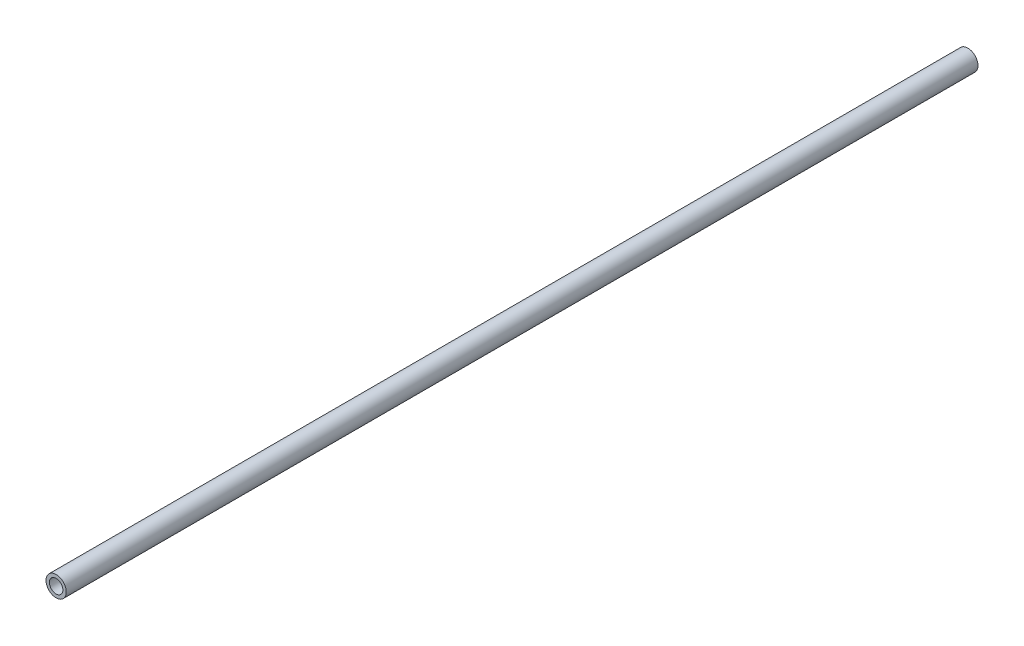
ISO-10303-21;
HEADER;
FILE_DESCRIPTION(('STEP AP214'),'2;1');
FILE_NAME('part.step','',(''),(''),'','','');
FILE_SCHEMA(('AUTOMOTIVE_DESIGN { 1 0 10303 214 1 1 1 1 }'));
ENDSEC;
DATA;
#1=APPLICATION_CONTEXT('core data for automotive mechanical design processes');
#2=APPLICATION_PROTOCOL_DEFINITION('international standard','automotive_design',2000,#1);
#3=PRODUCT_CONTEXT('',#1,'mechanical');
#4=PRODUCT('Part','Part','',(#3));
#5=PRODUCT_RELATED_PRODUCT_CATEGORY('part','',(#4));
#6=PRODUCT_DEFINITION_FORMATION('','',#4);
#7=PRODUCT_DEFINITION_CONTEXT('part definition',#1,'design');
#8=PRODUCT_DEFINITION('design','',#6,#7);
#9=PRODUCT_DEFINITION_SHAPE('','',#8);
#10=(LENGTH_UNIT() NAMED_UNIT(*) SI_UNIT(.MILLI.,.METRE.));
#11=(NAMED_UNIT(*) PLANE_ANGLE_UNIT() SI_UNIT($,.RADIAN.));
#12=(NAMED_UNIT(*) SI_UNIT($,.STERADIAN.) SOLID_ANGLE_UNIT());
#13=UNCERTAINTY_MEASURE_WITH_UNIT(LENGTH_MEASURE(1.E-05),#10,'distance_accuracy_value','');
#14=(GEOMETRIC_REPRESENTATION_CONTEXT(3) GLOBAL_UNCERTAINTY_ASSIGNED_CONTEXT((#13)) GLOBAL_UNIT_ASSIGNED_CONTEXT((#10,
#11,#12)) REPRESENTATION_CONTEXT('',''));
#15=CARTESIAN_POINT('',(0.,0.,0.));
#16=DIRECTION('',(0.,0.,1.));
#17=DIRECTION('',(1.,0.,0.));
#18=AXIS2_PLACEMENT_3D('',#15,#16,#17);
#19=CARTESIAN_POINT('',(0.,0.,270.));
#20=DIRECTION('',(0.,0.,1.));
#21=DIRECTION('',(1.,0.,0.));
#22=AXIS2_PLACEMENT_3D('',#19,#20,#21);
#23=PLANE('',#22);
#24=CARTESIAN_POINT('',(0.,0.,270.));
#25=DIRECTION('',(0.,0.,1.));
#26=DIRECTION('',(1.,0.,0.));
#27=AXIS2_PLACEMENT_3D('',#24,#25,#26);
#28=CIRCLE('',#27,3.);
#29=CARTESIAN_POINT('',(3.,0.,270.));
#30=VERTEX_POINT('',#29);
#31=EDGE_CURVE('E10',#30,#30,#28,.T.);
#32=ORIENTED_EDGE('',*,*,#31,.T.);
#33=EDGE_LOOP('',(#32));
#34=FACE_BOUND('',#33,.T.);
#35=CARTESIAN_POINT('',(0.,0.,270.));
#36=DIRECTION('',(0.,0.,1.));
#37=DIRECTION('',(1.,0.,0.));
#38=AXIS2_PLACEMENT_3D('',#35,#36,#37);
#39=CIRCLE('',#38,2.);
#40=CARTESIAN_POINT('',(2.,0.,270.));
#41=VERTEX_POINT('',#40);
#42=EDGE_CURVE('E54',#41,#41,#39,.T.);
#43=ORIENTED_EDGE('',*,*,#42,.F.);
#44=EDGE_LOOP('',(#43));
#45=FACE_BOUND('',#44,.T.);
#46=ADVANCED_FACE('F41',(#34,#45),#23,.T.);
#47=CARTESIAN_POINT('',(0.,0.,0.));
#48=DIRECTION('',(0.,0.,1.));
#49=DIRECTION('',(1.,0.,0.));
#50=AXIS2_PLACEMENT_3D('',#47,#48,#49);
#51=PLANE('',#50);
#52=CARTESIAN_POINT('',(0.,0.,0.));
#53=DIRECTION('',(0.,0.,1.));
#54=DIRECTION('',(1.,0.,0.));
#55=AXIS2_PLACEMENT_3D('',#52,#53,#54);
#56=CIRCLE('',#55,3.);
#57=CARTESIAN_POINT('',(3.,0.,0.));
#58=VERTEX_POINT('',#57);
#59=EDGE_CURVE('E45',#58,#58,#56,.T.);
#60=ORIENTED_EDGE('',*,*,#59,.F.);
#61=EDGE_LOOP('',(#60));
#62=FACE_BOUND('',#61,.T.);
#63=CARTESIAN_POINT('',(0.,0.,0.));
#64=DIRECTION('',(0.,0.,1.));
#65=DIRECTION('',(1.,0.,0.));
#66=AXIS2_PLACEMENT_3D('',#63,#64,#65);
#67=CIRCLE('',#66,2.);
#68=CARTESIAN_POINT('',(2.,0.,0.));
#69=VERTEX_POINT('',#68);
#70=EDGE_CURVE('E56',#69,#69,#67,.T.);
#71=ORIENTED_EDGE('',*,*,#70,.T.);
#72=EDGE_LOOP('',(#71));
#73=FACE_BOUND('',#72,.T.);
#74=ADVANCED_FACE('F68',(#62,#73),#51,.F.);
#75=CARTESIAN_POINT('',(0.,0.,270.));
#76=DIRECTION('',(0.,0.,-1.));
#77=DIRECTION('',(-1.,0.,0.));
#78=AXIS2_PLACEMENT_3D('',#75,#76,#77);
#79=CYLINDRICAL_SURFACE('',#78,3.);
#80=ORIENTED_EDGE('',*,*,#31,.F.);
#81=EDGE_LOOP('',(#80));
#82=FACE_BOUND('',#81,.T.);
#83=ORIENTED_EDGE('',*,*,#59,.T.);
#84=EDGE_LOOP('',(#83));
#85=FACE_BOUND('',#84,.T.);
#86=ADVANCED_FACE('F43',(#82,#85),#79,.T.);
#87=CARTESIAN_POINT('',(0.,0.,270.));
#88=DIRECTION('',(0.,0.,-1.));
#89=DIRECTION('',(-1.,0.,0.));
#90=AXIS2_PLACEMENT_3D('',#87,#88,#89);
#91=CYLINDRICAL_SURFACE('',#90,2.);
#92=ORIENTED_EDGE('',*,*,#42,.T.);
#93=EDGE_LOOP('',(#92));
#94=FACE_BOUND('',#93,.T.);
#95=ORIENTED_EDGE('',*,*,#70,.F.);
#96=EDGE_LOOP('',(#95));
#97=FACE_BOUND('',#96,.T.);
#98=ADVANCED_FACE('F64',(#94,#97),#91,.F.);
#99=CLOSED_SHELL('',(#46,#74,#86,#98));
#100=MANIFOLD_SOLID_BREP('B2',#99);
#101=ADVANCED_BREP_SHAPE_REPRESENTATION('',(#18,#100),#14);
#102=SHAPE_DEFINITION_REPRESENTATION(#9,#101);
ENDSEC;
END-ISO-10303-21;
